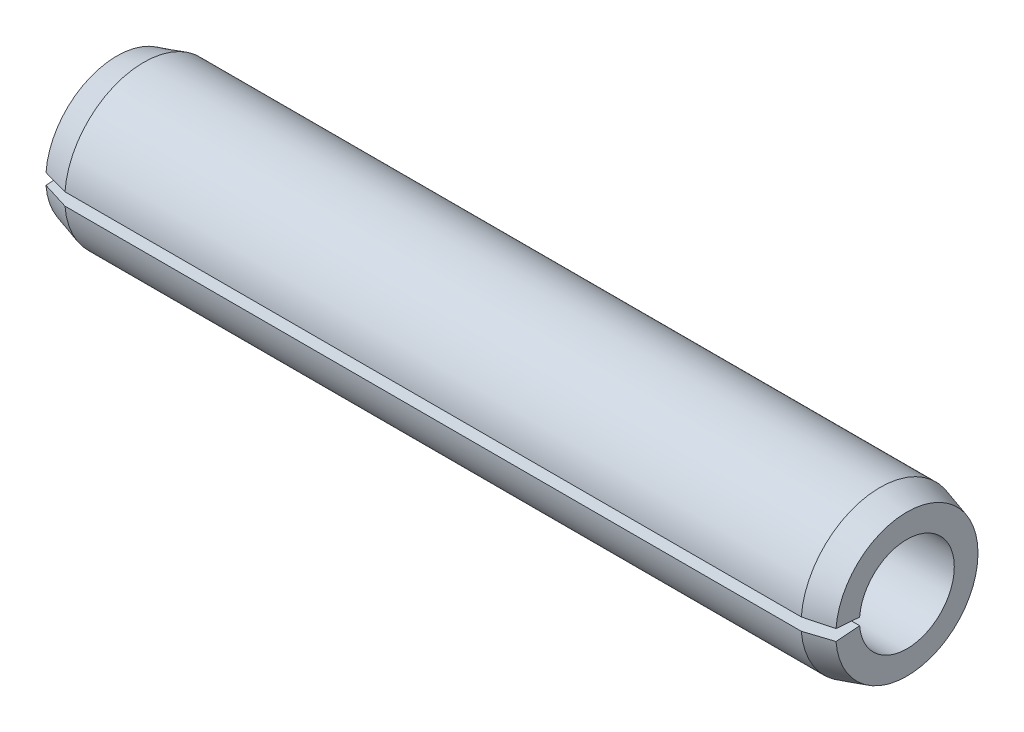
ISO-10303-21;
HEADER;
FILE_DESCRIPTION(('STEP AP214'),'2;1');
FILE_NAME('part.step','',(''),(''),'','','');
FILE_SCHEMA(('AUTOMOTIVE_DESIGN { 1 0 10303 214 1 1 1 1 }'));
ENDSEC;
DATA;
#1=APPLICATION_CONTEXT('core data for automotive mechanical design processes');
#2=APPLICATION_PROTOCOL_DEFINITION('international standard','automotive_design',2000,#1);
#3=PRODUCT_CONTEXT('',#1,'mechanical');
#4=PRODUCT('Part','Part','',(#3));
#5=PRODUCT_RELATED_PRODUCT_CATEGORY('part','',(#4));
#6=PRODUCT_DEFINITION_FORMATION('','',#4);
#7=PRODUCT_DEFINITION_CONTEXT('part definition',#1,'design');
#8=PRODUCT_DEFINITION('design','',#6,#7);
#9=PRODUCT_DEFINITION_SHAPE('','',#8);
#10=(LENGTH_UNIT() NAMED_UNIT(*) SI_UNIT(.MILLI.,.METRE.));
#11=(NAMED_UNIT(*) PLANE_ANGLE_UNIT() SI_UNIT($,.RADIAN.));
#12=(NAMED_UNIT(*) SI_UNIT($,.STERADIAN.) SOLID_ANGLE_UNIT());
#13=UNCERTAINTY_MEASURE_WITH_UNIT(LENGTH_MEASURE(1.E-05),#10,'distance_accuracy_value','');
#14=(GEOMETRIC_REPRESENTATION_CONTEXT(3) GLOBAL_UNCERTAINTY_ASSIGNED_CONTEXT((#13)) GLOBAL_UNIT_ASSIGNED_CONTEXT((#10,
#11,#12)) REPRESENTATION_CONTEXT('',''));
#15=CARTESIAN_POINT('',(0.,0.,0.));
#16=DIRECTION('',(0.,0.,1.));
#17=DIRECTION('',(1.,0.,0.));
#18=AXIS2_PLACEMENT_3D('',#15,#16,#17);
#19=CARTESIAN_POINT('',(0.,9.,0.));
#20=DIRECTION('',(1.,0.,0.));
#21=DIRECTION('',(0.,0.,-1.));
#22=AXIS2_PLACEMENT_3D('',#19,#20,#21);
#23=PLANE('',#22);
#24=DIRECTION('',(0.,0.0784590957278454,0.996917333733128));
#25=VECTOR('',#24,1.);
#26=CARTESIAN_POINT('',(0.,0.,0.));
#27=LINE('',#26,#25);
#28=CARTESIAN_POINT('',(0.,0.470754574367072,5.98150400239877));
#29=VERTEX_POINT('',#28);
#30=CARTESIAN_POINT('',(0.,0.706131861550608,8.97225600359815));
#31=VERTEX_POINT('',#30);
#32=EDGE_CURVE('E81',#29,#31,#27,.T.);
#33=ORIENTED_EDGE('',*,*,#32,.T.);
#34=CARTESIAN_POINT('',(0.,0.,0.));
#35=DIRECTION('',(-1.,0.,0.));
#36=DIRECTION('',(0.,0.,1.));
#37=AXIS2_PLACEMENT_3D('',#34,#35,#36);
#38=CIRCLE('',#37,9.);
#39=CARTESIAN_POINT('',(0.,-0.706131861550608,8.97225600359815));
#40=VERTEX_POINT('',#39);
#41=EDGE_CURVE('E99',#31,#40,#38,.T.);
#42=ORIENTED_EDGE('',*,*,#41,.T.);
#43=DIRECTION('',(0.,-0.0784590957278454,0.996917333733128));
#44=VECTOR('',#43,1.);
#45=CARTESIAN_POINT('',(0.,0.,0.));
#46=LINE('',#45,#44);
#47=CARTESIAN_POINT('',(0.,-0.470754574367072,5.98150400239877));
#48=VERTEX_POINT('',#47);
#49=EDGE_CURVE('E53',#48,#40,#46,.T.);
#50=ORIENTED_EDGE('',*,*,#49,.F.);
#51=CARTESIAN_POINT('',(0.,0.,0.));
#52=DIRECTION('',(-1.,0.,0.));
#53=DIRECTION('',(0.,0.,1.));
#54=AXIS2_PLACEMENT_3D('',#51,#52,#53);
#55=CIRCLE('',#54,6.);
#56=EDGE_CURVE('E96',#29,#48,#55,.T.);
#57=ORIENTED_EDGE('',*,*,#56,.F.);
#58=EDGE_LOOP('',(#33,#42,#50,#57));
#59=FACE_BOUND('',#58,.T.);
#60=ADVANCED_FACE('F32',(#59),#23,.F.);
#61=CARTESIAN_POINT('',(-9.52499999999999,0.,0.));
#62=DIRECTION('',(-1.,0.,0.));
#63=DIRECTION('',(0.,0.,1.));
#64=AXIS2_PLACEMENT_3D('',#61,#62,#63);
#65=CYLINDRICAL_SURFACE('',#64,6.);
#66=DIRECTION('',(-1.,0.,0.));
#67=VECTOR('',#66,1.);
#68=CARTESIAN_POINT('',(-9.52499999999999,0.470754574367072,5.98150400239877));
#69=LINE('',#68,#67);
#70=CARTESIAN_POINT('',(100.,0.470754574367072,5.98150400239877));
#71=VERTEX_POINT('',#70);
#72=EDGE_CURVE('E84',#29,#71,#69,.F.);
#73=ORIENTED_EDGE('',*,*,#72,.F.);
#74=ORIENTED_EDGE('',*,*,#56,.T.);
#75=DIRECTION('',(-1.,0.,0.));
#76=VECTOR('',#75,1.);
#77=CARTESIAN_POINT('',(-9.52499999999999,-0.470754574367072,5.98150400239877));
#78=LINE('',#77,#76);
#79=CARTESIAN_POINT('',(100.,-0.470754574367072,5.98150400239877));
#80=VERTEX_POINT('',#79);
#81=EDGE_CURVE('E117',#48,#80,#78,.F.);
#82=ORIENTED_EDGE('',*,*,#81,.T.);
#83=CARTESIAN_POINT('',(100.,0.,0.));
#84=DIRECTION('',(-1.,0.,0.));
#85=DIRECTION('',(0.,0.,1.));
#86=AXIS2_PLACEMENT_3D('',#83,#84,#85);
#87=CIRCLE('',#86,6.);
#88=EDGE_CURVE('E98',#71,#80,#87,.T.);
#89=ORIENTED_EDGE('',*,*,#88,.F.);
#90=EDGE_LOOP('',(#73,#74,#82,#89));
#91=FACE_BOUND('',#90,.T.);
#92=ADVANCED_FACE('F94',(#91),#65,.F.);
#93=CARTESIAN_POINT('',(100.,6.,0.));
#94=DIRECTION('',(-1.,0.,0.));
#95=DIRECTION('',(0.,0.,1.));
#96=AXIS2_PLACEMENT_3D('',#93,#94,#95);
#97=PLANE('',#96);
#98=DIRECTION('',(0.,0.0784590957278454,0.996917333733128));
#99=VECTOR('',#98,1.);
#100=CARTESIAN_POINT('',(100.,0.,0.));
#101=LINE('',#100,#99);
#102=CARTESIAN_POINT('',(100.,0.706131861550608,8.97225600359815));
#103=VERTEX_POINT('',#102);
#104=EDGE_CURVE('E126',#71,#103,#101,.T.);
#105=ORIENTED_EDGE('',*,*,#104,.F.);
#106=ORIENTED_EDGE('',*,*,#88,.T.);
#107=DIRECTION('',(0.,-0.0784590957278454,0.996917333733128));
#108=VECTOR('',#107,1.);
#109=CARTESIAN_POINT('',(100.,0.,0.));
#110=LINE('',#109,#108);
#111=CARTESIAN_POINT('',(100.,-0.706131861550608,8.97225600359815));
#112=VERTEX_POINT('',#111);
#113=EDGE_CURVE('E125',#80,#112,#110,.T.);
#114=ORIENTED_EDGE('',*,*,#113,.T.);
#115=CARTESIAN_POINT('',(100.,0.,0.));
#116=DIRECTION('',(-1.,0.,0.));
#117=DIRECTION('',(0.,0.,1.));
#118=AXIS2_PLACEMENT_3D('',#115,#116,#117);
#119=CIRCLE('',#118,9.);
#120=EDGE_CURVE('E103',#103,#112,#119,.T.);
#121=ORIENTED_EDGE('',*,*,#120,.F.);
#122=EDGE_LOOP('',(#105,#106,#114,#121));
#123=FACE_BOUND('',#122,.T.);
#124=ADVANCED_FACE('F136',(#123),#97,.F.);
#125=CARTESIAN_POINT('',(100.,0.,0.));
#126=DIRECTION('',(-1.,0.,0.));
#127=DIRECTION('',(0.,0.,1.));
#128=AXIS2_PLACEMENT_3D('',#125,#126,#127);
#129=CONICAL_SURFACE('',#128,9.,0.286051441717322);
#130=DIRECTION('',(-0.95936550157127,0.0221385146252275,0.281296499382938));
#131=VECTOR('',#130,1.);
#132=CARTESIAN_POINT('',(130.6,0.,0.));
#133=LINE('',#132,#131);
#134=CARTESIAN_POINT('',(96.6,0.784590957278454,9.96917333733128));
#135=VERTEX_POINT('',#134);
#136=EDGE_CURVE('E100',#103,#135,#133,.T.);
#137=ORIENTED_EDGE('',*,*,#136,.F.);
#138=ORIENTED_EDGE('',*,*,#120,.T.);
#139=DIRECTION('',(-0.95936550157127,-0.0221385146252275,0.281296499382938));
#140=VECTOR('',#139,1.);
#141=CARTESIAN_POINT('',(130.6,0.,0.));
#142=LINE('',#141,#140);
#143=CARTESIAN_POINT('',(96.6,-0.784590957278454,9.96917333733128));
#144=VERTEX_POINT('',#143);
#145=EDGE_CURVE('E119',#112,#144,#142,.T.);
#146=ORIENTED_EDGE('',*,*,#145,.T.);
#147=CARTESIAN_POINT('',(96.6,0.,0.));
#148=DIRECTION('',(-1.,0.,0.));
#149=DIRECTION('',(0.,0.,1.));
#150=AXIS2_PLACEMENT_3D('',#147,#148,#149);
#151=CIRCLE('',#150,10.);
#152=EDGE_CURVE('E108',#135,#144,#151,.T.);
#153=ORIENTED_EDGE('',*,*,#152,.F.);
#154=EDGE_LOOP('',(#137,#138,#146,#153));
#155=FACE_BOUND('',#154,.T.);
#156=ADVANCED_FACE('F135',(#155),#129,.T.);
#157=CARTESIAN_POINT('',(-9.52499999999999,0.,0.));
#158=DIRECTION('',(-1.,0.,0.));
#159=DIRECTION('',(0.,0.,1.));
#160=AXIS2_PLACEMENT_3D('',#157,#158,#159);
#161=CYLINDRICAL_SURFACE('',#160,10.);
#162=DIRECTION('',(-1.,0.,0.));
#163=VECTOR('',#162,1.);
#164=CARTESIAN_POINT('',(-9.52499999999999,0.784590957278454,9.96917333733128));
#165=LINE('',#164,#163);
#166=CARTESIAN_POINT('',(3.4,0.784590957278454,9.96917333733128));
#167=VERTEX_POINT('',#166);
#168=EDGE_CURVE('E45',#135,#167,#165,.T.);
#169=ORIENTED_EDGE('',*,*,#168,.F.);
#170=ORIENTED_EDGE('',*,*,#152,.T.);
#171=DIRECTION('',(-1.,0.,0.));
#172=VECTOR('',#171,1.);
#173=CARTESIAN_POINT('',(-9.52499999999999,-0.784590957278454,9.96917333733128));
#174=LINE('',#173,#172);
#175=CARTESIAN_POINT('',(3.4,-0.784590957278454,9.96917333733128));
#176=VERTEX_POINT('',#175);
#177=EDGE_CURVE('E122',#144,#176,#174,.T.);
#178=ORIENTED_EDGE('',*,*,#177,.T.);
#179=CARTESIAN_POINT('',(3.4,0.,0.));
#180=DIRECTION('',(-1.,0.,0.));
#181=DIRECTION('',(0.,0.,1.));
#182=AXIS2_PLACEMENT_3D('',#179,#180,#181);
#183=CIRCLE('',#182,10.);
#184=EDGE_CURVE('E111',#167,#176,#183,.T.);
#185=ORIENTED_EDGE('',*,*,#184,.F.);
#186=EDGE_LOOP('',(#169,#170,#178,#185));
#187=FACE_BOUND('',#186,.T.);
#188=ADVANCED_FACE('F139',(#187),#161,.T.);
#189=CARTESIAN_POINT('',(3.4,0.,0.));
#190=DIRECTION('',(1.,0.,0.));
#191=DIRECTION('',(0.,0.,-1.));
#192=AXIS2_PLACEMENT_3D('',#189,#190,#191);
#193=CONICAL_SURFACE('',#192,10.,0.286051441717319);
#194=DIRECTION('',(-0.959365501571271,-0.0221385146252273,-0.281296499382935));
#195=VECTOR('',#194,1.);
#196=CARTESIAN_POINT('',(-30.5999999999999,0.,0.));
#197=LINE('',#196,#195);
#198=EDGE_CURVE('E11',#167,#31,#197,.T.);
#199=ORIENTED_EDGE('',*,*,#198,.F.);
#200=ORIENTED_EDGE('',*,*,#184,.T.);
#201=DIRECTION('',(-0.959365501571271,0.0221385146252273,-0.281296499382935));
#202=VECTOR('',#201,1.);
#203=CARTESIAN_POINT('',(-30.5999999999999,0.,0.));
#204=LINE('',#203,#202);
#205=EDGE_CURVE('E39',#176,#40,#204,.T.);
#206=ORIENTED_EDGE('',*,*,#205,.T.);
#207=ORIENTED_EDGE('',*,*,#41,.F.);
#208=EDGE_LOOP('',(#199,#200,#206,#207));
#209=FACE_BOUND('',#208,.T.);
#210=ADVANCED_FACE('F142',(#209),#193,.T.);
#211=CARTESIAN_POINT('',(100.,0.,0.));
#212=DIRECTION('',(0.,-0.996917333733128,-0.0784590957278454));
#213=DIRECTION('',(0.,0.0784590957278454,-0.996917333733128));
#214=AXIS2_PLACEMENT_3D('',#211,#212,#213);
#215=PLANE('',#214);
#216=ORIENTED_EDGE('',*,*,#49,.T.);
#217=ORIENTED_EDGE('',*,*,#205,.F.);
#218=ORIENTED_EDGE('',*,*,#177,.F.);
#219=ORIENTED_EDGE('',*,*,#145,.F.);
#220=ORIENTED_EDGE('',*,*,#113,.F.);
#221=ORIENTED_EDGE('',*,*,#81,.F.);
#222=EDGE_LOOP('',(#216,#217,#218,#219,#220,#221));
#223=FACE_BOUND('',#222,.T.);
#224=ADVANCED_FACE('F137',(#223),#215,.F.);
#225=CARTESIAN_POINT('',(100.,0.,0.));
#226=DIRECTION('',(0.,-0.996917333733128,0.0784590957278454));
#227=DIRECTION('',(0.,-0.0784590957278454,-0.996917333733128));
#228=AXIS2_PLACEMENT_3D('',#225,#226,#227);
#229=PLANE('',#228);
#230=ORIENTED_EDGE('',*,*,#72,.T.);
#231=ORIENTED_EDGE('',*,*,#104,.T.);
#232=ORIENTED_EDGE('',*,*,#136,.T.);
#233=ORIENTED_EDGE('',*,*,#168,.T.);
#234=ORIENTED_EDGE('',*,*,#198,.T.);
#235=ORIENTED_EDGE('',*,*,#32,.F.);
#236=EDGE_LOOP('',(#230,#231,#232,#233,#234,#235));
#237=FACE_BOUND('',#236,.T.);
#238=ADVANCED_FACE('F83',(#237),#229,.T.);
#239=CLOSED_SHELL('',(#60,#92,#124,#156,#188,#210,#224,#238));
#240=MANIFOLD_SOLID_BREP('B2',#239);
#241=ADVANCED_BREP_SHAPE_REPRESENTATION('',(#18,#240),#14);
#242=SHAPE_DEFINITION_REPRESENTATION(#9,#241);
ENDSEC;
END-ISO-10303-21;
